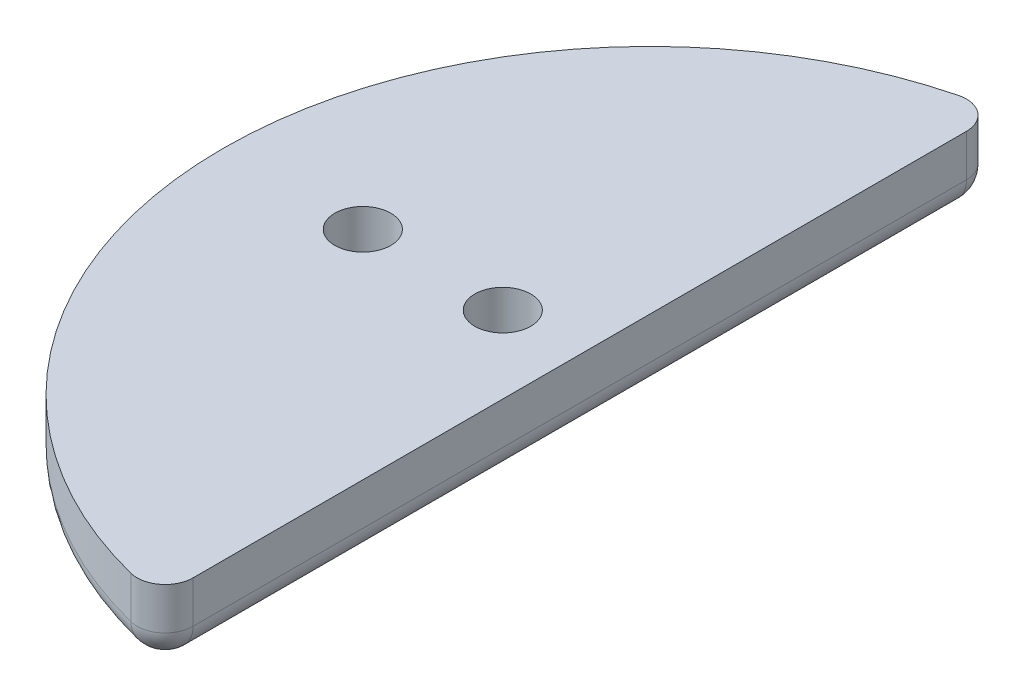
ISO-10303-21;
HEADER;
FILE_DESCRIPTION(('STEP AP214'),'2;1');
FILE_NAME('part.step','',(''),(''),'','','');
FILE_SCHEMA(('AUTOMOTIVE_DESIGN { 1 0 10303 214 1 1 1 1 }'));
ENDSEC;
DATA;
#1=APPLICATION_CONTEXT('core data for automotive mechanical design processes');
#2=APPLICATION_PROTOCOL_DEFINITION('international standard','automotive_design',2000,#1);
#3=PRODUCT_CONTEXT('',#1,'mechanical');
#4=PRODUCT('Part','Part','',(#3));
#5=PRODUCT_RELATED_PRODUCT_CATEGORY('part','',(#4));
#6=PRODUCT_DEFINITION_FORMATION('','',#4);
#7=PRODUCT_DEFINITION_CONTEXT('part definition',#1,'design');
#8=PRODUCT_DEFINITION('design','',#6,#7);
#9=PRODUCT_DEFINITION_SHAPE('','',#8);
#10=(LENGTH_UNIT() NAMED_UNIT(*) SI_UNIT(.MILLI.,.METRE.));
#11=(NAMED_UNIT(*) PLANE_ANGLE_UNIT() SI_UNIT($,.RADIAN.));
#12=(NAMED_UNIT(*) SI_UNIT($,.STERADIAN.) SOLID_ANGLE_UNIT());
#13=UNCERTAINTY_MEASURE_WITH_UNIT(LENGTH_MEASURE(1.E-05),#10,'distance_accuracy_value','');
#14=(GEOMETRIC_REPRESENTATION_CONTEXT(3) GLOBAL_UNCERTAINTY_ASSIGNED_CONTEXT((#13)) GLOBAL_UNIT_ASSIGNED_CONTEXT((#10,
#11,#12)) REPRESENTATION_CONTEXT('',''));
#15=CARTESIAN_POINT('',(0.,0.,0.));
#16=DIRECTION('',(0.,0.,1.));
#17=DIRECTION('',(1.,0.,0.));
#18=AXIS2_PLACEMENT_3D('',#15,#16,#17);
#19=CARTESIAN_POINT('',(0.,5.,0.));
#20=DIRECTION('',(0.,-1.,0.));
#21=DIRECTION('',(0.,0.,-1.));
#22=AXIS2_PLACEMENT_3D('',#19,#20,#21);
#23=CYLINDRICAL_SURFACE('',#22,30.5);
#24=CARTESIAN_POINT('',(0.,2.,0.));
#25=DIRECTION('',(0.,1.,0.));
#26=DIRECTION('',(0.,0.,1.));
#27=AXIS2_PLACEMENT_3D('',#24,#25,#26);
#28=CIRCLE('',#27,30.5);
#29=CARTESIAN_POINT('',(-7.49122807017544,2.,-29.5657149752989));
#30=VERTEX_POINT('',#29);
#31=CARTESIAN_POINT('',(-7.49122807017544,2.,29.5657149752989));
#32=VERTEX_POINT('',#31);
#33=EDGE_CURVE('E108',#30,#32,#28,.T.);
#34=ORIENTED_EDGE('',*,*,#33,.T.);
#35=DIRECTION('',(0.,-1.,0.));
#36=VECTOR('',#35,1.);
#37=CARTESIAN_POINT('',(-7.49122807017544,5.,29.5657149752989));
#38=LINE('',#37,#36);
#39=CARTESIAN_POINT('',(-7.49122807017544,5.,29.5657149752989));
#40=VERTEX_POINT('',#39);
#41=EDGE_CURVE('E102',#32,#40,#38,.F.);
#42=ORIENTED_EDGE('',*,*,#41,.T.);
#43=CARTESIAN_POINT('',(0.,5.,0.));
#44=DIRECTION('',(0.,1.,0.));
#45=DIRECTION('',(0.,0.,1.));
#46=AXIS2_PLACEMENT_3D('',#43,#44,#45);
#47=CIRCLE('',#46,30.5);
#48=CARTESIAN_POINT('',(-7.49122807017544,5.,-29.5657149752989));
#49=VERTEX_POINT('',#48);
#50=EDGE_CURVE('E91',#49,#40,#47,.T.);
#51=ORIENTED_EDGE('',*,*,#50,.F.);
#52=DIRECTION('',(0.,-1.,0.));
#53=VECTOR('',#52,1.);
#54=CARTESIAN_POINT('',(-7.49122807017544,5.,-29.5657149752989));
#55=LINE('',#54,#53);
#56=EDGE_CURVE('E99',#49,#30,#55,.T.);
#57=ORIENTED_EDGE('',*,*,#56,.T.);
#58=EDGE_LOOP('',(#34,#42,#51,#57));
#59=FACE_BOUND('',#58,.T.);
#60=ADVANCED_FACE('F41',(#59),#23,.T.);
#61=CARTESIAN_POINT('',(-5.,5.,-30.0873727666608));
#62=DIRECTION('',(1.,0.,0.));
#63=DIRECTION('',(0.,0.,-1.));
#64=AXIS2_PLACEMENT_3D('',#61,#62,#63);
#65=PLANE('',#64);
#66=DIRECTION('',(0.,0.,1.));
#67=VECTOR('',#66,1.);
#68=CARTESIAN_POINT('',(-5.,5.,-30.0873727666608));
#69=LINE('',#68,#67);
#70=CARTESIAN_POINT('',(-5.,5.,-27.6269795670826));
#71=VERTEX_POINT('',#70);
#72=CARTESIAN_POINT('',(-5.,5.,27.6269795670826));
#73=VERTEX_POINT('',#72);
#74=EDGE_CURVE('E93',#71,#73,#69,.T.);
#75=ORIENTED_EDGE('',*,*,#74,.T.);
#76=DIRECTION('',(0.,1.,0.));
#77=VECTOR('',#76,1.);
#78=CARTESIAN_POINT('',(-5.,0.,27.6269795670826));
#79=LINE('',#78,#77);
#80=CARTESIAN_POINT('',(-5.,2.,27.6269795670826));
#81=VERTEX_POINT('',#80);
#82=EDGE_CURVE('E63',#73,#81,#79,.F.);
#83=ORIENTED_EDGE('',*,*,#82,.T.);
#84=DIRECTION('',(0.,0.,1.));
#85=VECTOR('',#84,1.);
#86=CARTESIAN_POINT('',(-5.,2.,-30.0873727666608));
#87=LINE('',#86,#85);
#88=CARTESIAN_POINT('',(-5.,2.,-27.6269795670826));
#89=VERTEX_POINT('',#88);
#90=EDGE_CURVE('E58',#81,#89,#87,.F.);
#91=ORIENTED_EDGE('',*,*,#90,.T.);
#92=DIRECTION('',(0.,1.,0.));
#93=VECTOR('',#92,1.);
#94=CARTESIAN_POINT('',(-5.,5.,-27.6269795670826));
#95=LINE('',#94,#93);
#96=EDGE_CURVE('E120',#89,#71,#95,.T.);
#97=ORIENTED_EDGE('',*,*,#96,.T.);
#98=EDGE_LOOP('',(#75,#83,#91,#97));
#99=FACE_BOUND('',#98,.T.);
#100=ADVANCED_FACE('F156',(#99),#65,.T.);
#101=CARTESIAN_POINT('',(0.,5.,0.));
#102=DIRECTION('',(0.,1.,0.));
#103=DIRECTION('',(0.,0.,1.));
#104=AXIS2_PLACEMENT_3D('',#101,#102,#103);
#105=PLANE('',#104);
#106=CARTESIAN_POINT('',(-20.5,5.,0.));
#107=DIRECTION('',(0.,1.,0.));
#108=DIRECTION('',(0.,0.,1.));
#109=AXIS2_PLACEMENT_3D('',#106,#107,#108);
#110=CIRCLE('',#109,1.99999999999998);
#111=CARTESIAN_POINT('',(-20.5,5.,1.99999999999998));
#112=VERTEX_POINT('',#111);
#113=EDGE_CURVE('E138',#112,#112,#110,.T.);
#114=ORIENTED_EDGE('',*,*,#113,.F.);
#115=EDGE_LOOP('',(#114));
#116=FACE_BOUND('',#115,.T.);
#117=CARTESIAN_POINT('',(-10.5,5.,0.));
#118=DIRECTION('',(0.,1.,0.));
#119=DIRECTION('',(0.,0.,1.));
#120=AXIS2_PLACEMENT_3D('',#117,#118,#119);
#121=CIRCLE('',#120,1.99999999999998);
#122=CARTESIAN_POINT('',(-10.5,5.,1.99999999999998));
#123=VERTEX_POINT('',#122);
#124=EDGE_CURVE('E103',#123,#123,#121,.T.);
#125=ORIENTED_EDGE('',*,*,#124,.F.);
#126=EDGE_LOOP('',(#125));
#127=FACE_BOUND('',#126,.T.);
#128=ORIENTED_EDGE('',*,*,#50,.T.);
#129=CARTESIAN_POINT('',(-7.,5.,27.6269795670826));
#130=DIRECTION('',(0.,1.,0.));
#131=DIRECTION('',(0.,0.,1.));
#132=AXIS2_PLACEMENT_3D('',#129,#130,#131);
#133=CIRCLE('',#132,2.);
#134=EDGE_CURVE('E11',#40,#73,#133,.T.);
#135=ORIENTED_EDGE('',*,*,#134,.T.);
#136=ORIENTED_EDGE('',*,*,#74,.F.);
#137=CARTESIAN_POINT('',(-7.,5.,-27.6269795670826));
#138=DIRECTION('',(0.,1.,0.));
#139=DIRECTION('',(0.,0.,1.));
#140=AXIS2_PLACEMENT_3D('',#137,#138,#139);
#141=CIRCLE('',#140,2.);
#142=EDGE_CURVE('E50',#71,#49,#141,.T.);
#143=ORIENTED_EDGE('',*,*,#142,.T.);
#144=EDGE_LOOP('',(#128,#135,#136,#143));
#145=FACE_BOUND('',#144,.T.);
#146=ADVANCED_FACE('F90',(#116,#127,#145),#105,.T.);
#147=CARTESIAN_POINT('',(0.,0.,0.));
#148=DIRECTION('',(0.,1.,0.));
#149=DIRECTION('',(0.,0.,1.));
#150=AXIS2_PLACEMENT_3D('',#147,#148,#149);
#151=PLANE('',#150);
#152=DIRECTION('',(0.,0.,1.));
#153=VECTOR('',#152,1.);
#154=CARTESIAN_POINT('',(-7.,0.,30.0873727666608));
#155=LINE('',#154,#153);
#156=CARTESIAN_POINT('',(-7.,0.,-27.6269795670826));
#157=VERTEX_POINT('',#156);
#158=CARTESIAN_POINT('',(-7.,0.,27.6269795670826));
#159=VERTEX_POINT('',#158);
#160=EDGE_CURVE('E114',#157,#159,#155,.T.);
#161=ORIENTED_EDGE('',*,*,#160,.T.);
#162=CARTESIAN_POINT('',(0.,0.,0.));
#163=DIRECTION('',(0.,1.,0.));
#164=DIRECTION('',(0.,0.,1.));
#165=AXIS2_PLACEMENT_3D('',#162,#163,#164);
#166=CIRCLE('',#165,28.5);
#167=EDGE_CURVE('E116',#159,#157,#166,.F.);
#168=ORIENTED_EDGE('',*,*,#167,.T.);
#169=EDGE_LOOP('',(#161,#168));
#170=FACE_BOUND('',#169,.T.);
#171=CARTESIAN_POINT('',(-20.5,0.,0.));
#172=DIRECTION('',(0.,-1.,0.));
#173=DIRECTION('',(0.,0.,-1.));
#174=AXIS2_PLACEMENT_3D('',#171,#172,#173);
#175=CIRCLE('',#174,1.99999999999998);
#176=CARTESIAN_POINT('',(-20.5,0.,-1.99999999999998));
#177=VERTEX_POINT('',#176);
#178=EDGE_CURVE('E134',#177,#177,#175,.T.);
#179=ORIENTED_EDGE('',*,*,#178,.F.);
#180=EDGE_LOOP('',(#179));
#181=FACE_BOUND('',#180,.T.);
#182=CARTESIAN_POINT('',(-10.5,0.,0.));
#183=DIRECTION('',(0.,-1.,0.));
#184=DIRECTION('',(0.,0.,-1.));
#185=AXIS2_PLACEMENT_3D('',#182,#183,#184);
#186=CIRCLE('',#185,1.99999999999999);
#187=CARTESIAN_POINT('',(-10.5,0.,-1.99999999999999));
#188=VERTEX_POINT('',#187);
#189=EDGE_CURVE('E143',#188,#188,#186,.T.);
#190=ORIENTED_EDGE('',*,*,#189,.F.);
#191=EDGE_LOOP('',(#190));
#192=FACE_BOUND('',#191,.T.);
#193=ADVANCED_FACE('F155',(#170,#181,#192),#151,.F.);
#194=CARTESIAN_POINT('',(-10.5,0.,0.));
#195=DIRECTION('',(0.,-1.,0.));
#196=DIRECTION('',(0.,0.,-1.));
#197=AXIS2_PLACEMENT_3D('',#194,#195,#196);
#198=CYLINDRICAL_SURFACE('',#197,1.99999999999998);
#199=ORIENTED_EDGE('',*,*,#124,.T.);
#200=EDGE_LOOP('',(#199));
#201=FACE_BOUND('',#200,.T.);
#202=ORIENTED_EDGE('',*,*,#189,.T.);
#203=EDGE_LOOP('',(#202));
#204=FACE_BOUND('',#203,.T.);
#205=ADVANCED_FACE('F151',(#201,#204),#198,.F.);
#206=CARTESIAN_POINT('',(-20.5,0.,0.));
#207=DIRECTION('',(0.,-1.,0.));
#208=DIRECTION('',(0.,0.,-1.));
#209=AXIS2_PLACEMENT_3D('',#206,#207,#208);
#210=CYLINDRICAL_SURFACE('',#209,1.99999999999998);
#211=ORIENTED_EDGE('',*,*,#113,.T.);
#212=EDGE_LOOP('',(#211));
#213=FACE_BOUND('',#212,.T.);
#214=ORIENTED_EDGE('',*,*,#178,.T.);
#215=EDGE_LOOP('',(#214));
#216=FACE_BOUND('',#215,.T.);
#217=ADVANCED_FACE('F194',(#213,#216),#210,.F.);
#218=CARTESIAN_POINT('',(-7.,5.,-27.6269795670826));
#219=DIRECTION('',(0.,-1.,0.));
#220=DIRECTION('',(0.,0.,-1.));
#221=AXIS2_PLACEMENT_3D('',#218,#219,#220);
#222=CYLINDRICAL_SURFACE('',#221,2.);
#223=ORIENTED_EDGE('',*,*,#142,.F.);
#224=ORIENTED_EDGE('',*,*,#96,.F.);
#225=CARTESIAN_POINT('',(-7.,2.,-27.6269795670826));
#226=DIRECTION('',(0.,-1.,0.));
#227=DIRECTION('',(0.,0.,-1.));
#228=AXIS2_PLACEMENT_3D('',#225,#226,#227);
#229=CIRCLE('',#228,2.);
#230=EDGE_CURVE('E106',#30,#89,#229,.T.);
#231=ORIENTED_EDGE('',*,*,#230,.F.);
#232=ORIENTED_EDGE('',*,*,#56,.F.);
#233=EDGE_LOOP('',(#223,#224,#231,#232));
#234=FACE_BOUND('',#233,.T.);
#235=ADVANCED_FACE('F43',(#234),#222,.T.);
#236=CARTESIAN_POINT('',(-7.,5.,27.6269795670826));
#237=DIRECTION('',(0.,-1.,0.));
#238=DIRECTION('',(0.,0.,-1.));
#239=AXIS2_PLACEMENT_3D('',#236,#237,#238);
#240=CYLINDRICAL_SURFACE('',#239,2.);
#241=ORIENTED_EDGE('',*,*,#134,.F.);
#242=ORIENTED_EDGE('',*,*,#41,.F.);
#243=CARTESIAN_POINT('',(-7.,2.,27.6269795670826));
#244=DIRECTION('',(0.,-1.,0.));
#245=DIRECTION('',(0.,0.,-1.));
#246=AXIS2_PLACEMENT_3D('',#243,#244,#245);
#247=CIRCLE('',#246,2.);
#248=EDGE_CURVE('E130',#81,#32,#247,.T.);
#249=ORIENTED_EDGE('',*,*,#248,.F.);
#250=ORIENTED_EDGE('',*,*,#82,.F.);
#251=EDGE_LOOP('',(#241,#242,#249,#250));
#252=FACE_BOUND('',#251,.T.);
#253=ADVANCED_FACE('F187',(#252),#240,.T.);
#254=CARTESIAN_POINT('',(-7.,2.,0.));
#255=DIRECTION('',(0.,0.,-1.));
#256=DIRECTION('',(-1.,0.,0.));
#257=AXIS2_PLACEMENT_3D('',#254,#255,#256);
#258=CYLINDRICAL_SURFACE('',#257,2.);
#259=CARTESIAN_POINT('',(-7.,2.,-27.6269795670826));
#260=DIRECTION('',(0.,0.,-1.));
#261=DIRECTION('',(-1.,0.,0.));
#262=AXIS2_PLACEMENT_3D('',#259,#260,#261);
#263=CIRCLE('',#262,2.);
#264=EDGE_CURVE('E45',#89,#157,#263,.T.);
#265=ORIENTED_EDGE('',*,*,#264,.F.);
#266=ORIENTED_EDGE('',*,*,#90,.F.);
#267=CARTESIAN_POINT('',(-7.,2.,27.6269795670826));
#268=DIRECTION('',(0.,0.,1.));
#269=DIRECTION('',(1.,0.,0.));
#270=AXIS2_PLACEMENT_3D('',#267,#268,#269);
#271=CIRCLE('',#270,2.);
#272=EDGE_CURVE('E127',#159,#81,#271,.T.);
#273=ORIENTED_EDGE('',*,*,#272,.F.);
#274=ORIENTED_EDGE('',*,*,#160,.F.);
#275=EDGE_LOOP('',(#265,#266,#273,#274));
#276=FACE_BOUND('',#275,.T.);
#277=ADVANCED_FACE('F185',(#276),#258,.T.);
#278=CARTESIAN_POINT('',(-7.,2.,-27.6269795670826));
#279=DIRECTION('',(0.,-1.,0.));
#280=DIRECTION('',(0.,0.,-1.));
#281=AXIS2_PLACEMENT_3D('',#278,#279,#280);
#282=SPHERICAL_SURFACE('',#281,2.);
#283=ORIENTED_EDGE('',*,*,#230,.T.);
#284=ORIENTED_EDGE('',*,*,#264,.T.);
#285=CARTESIAN_POINT('',(-7.,2.,-27.6269795670826));
#286=DIRECTION('',(0.969367704108162,0.,-0.245614035087719));
#287=DIRECTION('',(-0.245614035087719,0.,-0.969367704108162));
#288=AXIS2_PLACEMENT_3D('',#285,#286,#287);
#289=CIRCLE('',#288,2.);
#290=EDGE_CURVE('E125',#30,#157,#289,.F.);
#291=ORIENTED_EDGE('',*,*,#290,.F.);
#292=EDGE_LOOP('',(#283,#284,#291));
#293=FACE_BOUND('',#292,.T.);
#294=ADVANCED_FACE('F181',(#293),#282,.T.);
#295=CARTESIAN_POINT('',(-7.,2.,27.6269795670826));
#296=DIRECTION('',(0.,-1.,0.));
#297=DIRECTION('',(0.,0.,-1.));
#298=AXIS2_PLACEMENT_3D('',#295,#296,#297);
#299=SPHERICAL_SURFACE('',#298,2.);
#300=ORIENTED_EDGE('',*,*,#272,.T.);
#301=ORIENTED_EDGE('',*,*,#248,.T.);
#302=CARTESIAN_POINT('',(-7.,2.,27.6269795670826));
#303=DIRECTION('',(0.969367704108162,0.,0.245614035087719));
#304=DIRECTION('',(0.245614035087719,0.,-0.969367704108162));
#305=AXIS2_PLACEMENT_3D('',#302,#303,#304);
#306=CIRCLE('',#305,2.);
#307=EDGE_CURVE('E123',#159,#32,#306,.F.);
#308=ORIENTED_EDGE('',*,*,#307,.F.);
#309=EDGE_LOOP('',(#300,#301,#308));
#310=FACE_BOUND('',#309,.T.);
#311=ADVANCED_FACE('F177',(#310),#299,.T.);
#312=CARTESIAN_POINT('',(0.,2.,0.));
#313=DIRECTION('',(0.,1.,0.));
#314=DIRECTION('',(0.,0.,1.));
#315=AXIS2_PLACEMENT_3D('',#312,#313,#314);
#316=TOROIDAL_SURFACE('',#315,28.5,2.);
#317=ORIENTED_EDGE('',*,*,#290,.T.);
#318=ORIENTED_EDGE('',*,*,#167,.F.);
#319=ORIENTED_EDGE('',*,*,#307,.T.);
#320=ORIENTED_EDGE('',*,*,#33,.F.);
#321=EDGE_LOOP('',(#317,#318,#319,#320));
#322=FACE_BOUND('',#321,.T.);
#323=ADVANCED_FACE('F174',(#322),#316,.T.);
#324=CLOSED_SHELL('',(#60,#100,#146,#193,#205,#217,#235,#253,#277,#294,#311,#323));
#325=MANIFOLD_SOLID_BREP('B2',#324);
#326=ADVANCED_BREP_SHAPE_REPRESENTATION('',(#18,#325),#14);
#327=SHAPE_DEFINITION_REPRESENTATION(#9,#326);
ENDSEC;
END-ISO-10303-21;
